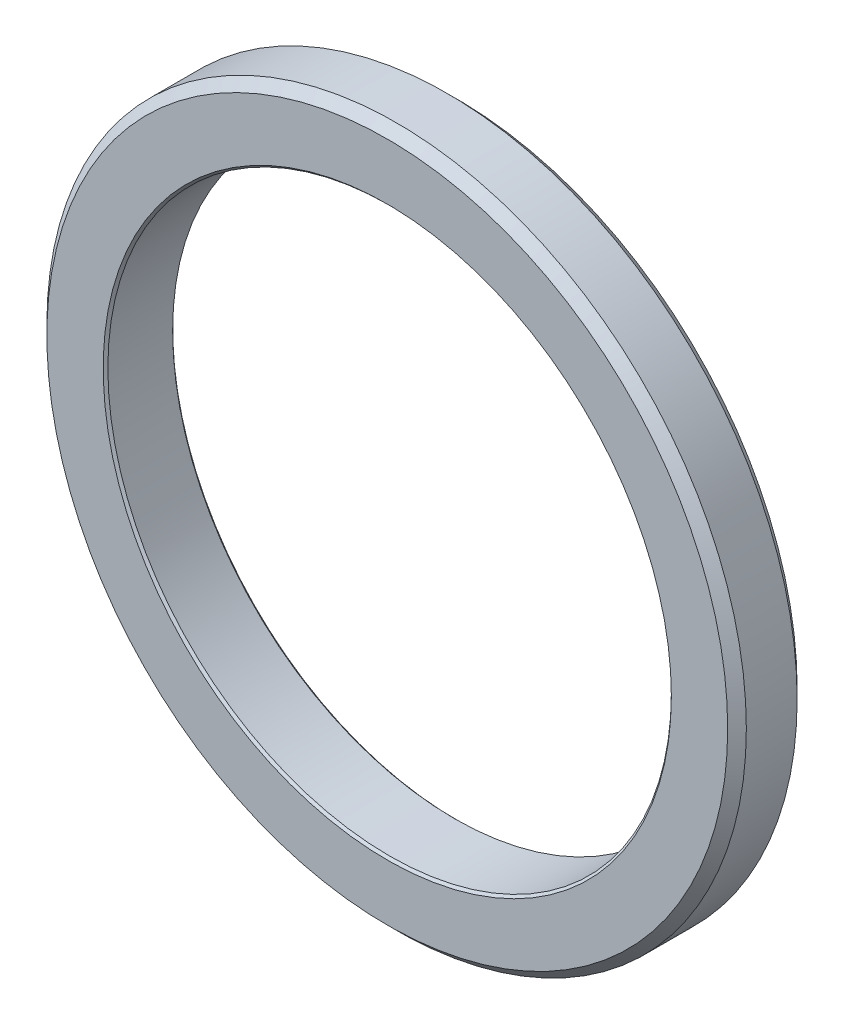
ISO-10303-21;
HEADER;
FILE_DESCRIPTION(('STEP AP214'),'2;1');
FILE_NAME('part.step','',(''),(''),'','','');
FILE_SCHEMA(('AUTOMOTIVE_DESIGN { 1 0 10303 214 1 1 1 1 }'));
ENDSEC;
DATA;
#1=APPLICATION_CONTEXT('core data for automotive mechanical design processes');
#2=APPLICATION_PROTOCOL_DEFINITION('international standard','automotive_design',2000,#1);
#3=PRODUCT_CONTEXT('',#1,'mechanical');
#4=PRODUCT('Part','Part','',(#3));
#5=PRODUCT_RELATED_PRODUCT_CATEGORY('part','',(#4));
#6=PRODUCT_DEFINITION_FORMATION('','',#4);
#7=PRODUCT_DEFINITION_CONTEXT('part definition',#1,'design');
#8=PRODUCT_DEFINITION('design','',#6,#7);
#9=PRODUCT_DEFINITION_SHAPE('','',#8);
#10=(LENGTH_UNIT() NAMED_UNIT(*) SI_UNIT(.MILLI.,.METRE.));
#11=(NAMED_UNIT(*) PLANE_ANGLE_UNIT() SI_UNIT($,.RADIAN.));
#12=(NAMED_UNIT(*) SI_UNIT($,.STERADIAN.) SOLID_ANGLE_UNIT());
#13=UNCERTAINTY_MEASURE_WITH_UNIT(LENGTH_MEASURE(1.E-05),#10,'distance_accuracy_value','');
#14=(GEOMETRIC_REPRESENTATION_CONTEXT(3) GLOBAL_UNCERTAINTY_ASSIGNED_CONTEXT((#13)) GLOBAL_UNIT_ASSIGNED_CONTEXT((#10,
#11,#12)) REPRESENTATION_CONTEXT('',''));
#15=CARTESIAN_POINT('',(0.,0.,0.));
#16=DIRECTION('',(0.,0.,1.));
#17=DIRECTION('',(1.,0.,0.));
#18=AXIS2_PLACEMENT_3D('',#15,#16,#17);
#19=CARTESIAN_POINT('',(0.,36.5195,0.));
#20=DIRECTION('',(0.,0.,-1.));
#21=DIRECTION('',(-1.,0.,0.));
#22=AXIS2_PLACEMENT_3D('',#19,#20,#21);
#23=PLANE('',#22);
#24=CARTESIAN_POINT('',(0.,0.,0.));
#25=DIRECTION('',(0.,0.,1.));
#26=DIRECTION('',(1.,0.,0.));
#27=AXIS2_PLACEMENT_3D('',#24,#25,#26);
#28=CIRCLE('',#27,30.475);
#29=CARTESIAN_POINT('',(30.475,0.,0.));
#30=VERTEX_POINT('',#29);
#31=EDGE_CURVE('E10',#30,#30,#28,.T.);
#32=ORIENTED_EDGE('',*,*,#31,.F.);
#33=EDGE_LOOP('',(#32));
#34=FACE_BOUND('',#33,.T.);
#35=CARTESIAN_POINT('',(0.,0.,0.));
#36=DIRECTION('',(0.,0.,1.));
#37=DIRECTION('',(1.,0.,0.));
#38=AXIS2_PLACEMENT_3D('',#35,#36,#37);
#39=CIRCLE('',#38,36.5195);
#40=CARTESIAN_POINT('',(36.5195,0.,0.));
#41=VERTEX_POINT('',#40);
#42=EDGE_CURVE('E67',#41,#41,#39,.T.);
#43=ORIENTED_EDGE('',*,*,#42,.T.);
#44=EDGE_LOOP('',(#43));
#45=FACE_BOUND('',#44,.T.);
#46=ADVANCED_FACE('F39',(#34,#45),#23,.F.);
#47=CARTESIAN_POINT('',(0.,0.,0.));
#48=DIRECTION('',(0.,0.,1.));
#49=DIRECTION('',(1.,0.,0.));
#50=AXIS2_PLACEMENT_3D('',#47,#48,#49);
#51=CONICAL_SURFACE('',#50,30.475,0.785398163397449);
#52=CARTESIAN_POINT('',(0.,0.,-0.250000000000001));
#53=DIRECTION('',(0.,0.,1.));
#54=DIRECTION('',(1.,0.,0.));
#55=AXIS2_PLACEMENT_3D('',#52,#53,#54);
#56=CIRCLE('',#55,30.225);
#57=CARTESIAN_POINT('',(30.225,0.,-0.250000000000001));
#58=VERTEX_POINT('',#57);
#59=EDGE_CURVE('E45',#58,#58,#56,.T.);
#60=ORIENTED_EDGE('',*,*,#59,.F.);
#61=EDGE_LOOP('',(#60));
#62=FACE_BOUND('',#61,.T.);
#63=ORIENTED_EDGE('',*,*,#31,.T.);
#64=EDGE_LOOP('',(#63));
#65=FACE_BOUND('',#64,.T.);
#66=ADVANCED_FACE('F104',(#62,#65),#51,.F.);
#67=CARTESIAN_POINT('',(0.,0.,0.));
#68=DIRECTION('',(0.,0.,1.));
#69=DIRECTION('',(1.,0.,0.));
#70=AXIS2_PLACEMENT_3D('',#67,#68,#69);
#71=CYLINDRICAL_SURFACE('',#70,30.225);
#72=CARTESIAN_POINT('',(0.,0.,-7.2));
#73=DIRECTION('',(0.,0.,1.));
#74=DIRECTION('',(1.,0.,0.));
#75=AXIS2_PLACEMENT_3D('',#72,#73,#74);
#76=CIRCLE('',#75,30.225);
#77=CARTESIAN_POINT('',(30.225,0.,-7.2));
#78=VERTEX_POINT('',#77);
#79=EDGE_CURVE('E49',#78,#78,#76,.T.);
#80=ORIENTED_EDGE('',*,*,#79,.F.);
#81=EDGE_LOOP('',(#80));
#82=FACE_BOUND('',#81,.T.);
#83=ORIENTED_EDGE('',*,*,#59,.T.);
#84=EDGE_LOOP('',(#83));
#85=FACE_BOUND('',#84,.T.);
#86=ADVANCED_FACE('F99',(#82,#85),#71,.F.);
#87=CARTESIAN_POINT('',(0.,0.,-7.2));
#88=DIRECTION('',(0.,0.,-1.));
#89=DIRECTION('',(-1.,0.,0.));
#90=AXIS2_PLACEMENT_3D('',#87,#88,#89);
#91=CONICAL_SURFACE('',#90,30.225,0.785398163397448);
#92=CARTESIAN_POINT('',(0.,0.,-7.45));
#93=DIRECTION('',(0.,0.,1.));
#94=DIRECTION('',(1.,0.,0.));
#95=AXIS2_PLACEMENT_3D('',#92,#93,#94);
#96=CIRCLE('',#95,30.475);
#97=CARTESIAN_POINT('',(30.475,0.,-7.45));
#98=VERTEX_POINT('',#97);
#99=EDGE_CURVE('E53',#98,#98,#96,.T.);
#100=ORIENTED_EDGE('',*,*,#99,.F.);
#101=EDGE_LOOP('',(#100));
#102=FACE_BOUND('',#101,.T.);
#103=ORIENTED_EDGE('',*,*,#79,.T.);
#104=EDGE_LOOP('',(#103));
#105=FACE_BOUND('',#104,.T.);
#106=ADVANCED_FACE('F93',(#102,#105),#91,.F.);
#107=CARTESIAN_POINT('',(0.,36.5195,-7.45));
#108=DIRECTION('',(0.,0.,1.));
#109=DIRECTION('',(1.,0.,0.));
#110=AXIS2_PLACEMENT_3D('',#107,#108,#109);
#111=PLANE('',#110);
#112=CARTESIAN_POINT('',(0.,0.,-7.45));
#113=DIRECTION('',(0.,0.,1.));
#114=DIRECTION('',(1.,0.,0.));
#115=AXIS2_PLACEMENT_3D('',#112,#113,#114);
#116=CIRCLE('',#115,36.5195);
#117=CARTESIAN_POINT('',(36.5195,0.,-7.45));
#118=VERTEX_POINT('',#117);
#119=EDGE_CURVE('E58',#118,#118,#116,.T.);
#120=ORIENTED_EDGE('',*,*,#119,.F.);
#121=EDGE_LOOP('',(#120));
#122=FACE_BOUND('',#121,.T.);
#123=ORIENTED_EDGE('',*,*,#99,.T.);
#124=EDGE_LOOP('',(#123));
#125=FACE_BOUND('',#124,.T.);
#126=ADVANCED_FACE('F87',(#122,#125),#111,.F.);
#127=CARTESIAN_POINT('',(0.,0.,-7.45));
#128=DIRECTION('',(0.,0.,1.));
#129=DIRECTION('',(1.,0.,0.));
#130=AXIS2_PLACEMENT_3D('',#127,#128,#129);
#131=CONICAL_SURFACE('',#130,36.5195,0.785398163397448);
#132=CARTESIAN_POINT('',(0.,0.,-6.45));
#133=DIRECTION('',(0.,0.,1.));
#134=DIRECTION('',(1.,0.,0.));
#135=AXIS2_PLACEMENT_3D('',#132,#133,#134);
#136=CIRCLE('',#135,37.5195);
#137=CARTESIAN_POINT('',(37.5195,0.,-6.45));
#138=VERTEX_POINT('',#137);
#139=EDGE_CURVE('E61',#138,#138,#136,.T.);
#140=ORIENTED_EDGE('',*,*,#139,.F.);
#141=EDGE_LOOP('',(#140));
#142=FACE_BOUND('',#141,.T.);
#143=ORIENTED_EDGE('',*,*,#119,.T.);
#144=EDGE_LOOP('',(#143));
#145=FACE_BOUND('',#144,.T.);
#146=ADVANCED_FACE('F81',(#142,#145),#131,.T.);
#147=CARTESIAN_POINT('',(0.,0.,0.));
#148=DIRECTION('',(0.,0.,1.));
#149=DIRECTION('',(1.,0.,0.));
#150=AXIS2_PLACEMENT_3D('',#147,#148,#149);
#151=CYLINDRICAL_SURFACE('',#150,37.5195);
#152=CARTESIAN_POINT('',(0.,0.,-1.));
#153=DIRECTION('',(0.,0.,1.));
#154=DIRECTION('',(1.,0.,0.));
#155=AXIS2_PLACEMENT_3D('',#152,#153,#154);
#156=CIRCLE('',#155,37.5195);
#157=CARTESIAN_POINT('',(37.5195,0.,-1.));
#158=VERTEX_POINT('',#157);
#159=EDGE_CURVE('E64',#158,#158,#156,.T.);
#160=ORIENTED_EDGE('',*,*,#159,.F.);
#161=EDGE_LOOP('',(#160));
#162=FACE_BOUND('',#161,.T.);
#163=ORIENTED_EDGE('',*,*,#139,.T.);
#164=EDGE_LOOP('',(#163));
#165=FACE_BOUND('',#164,.T.);
#166=ADVANCED_FACE('F75',(#162,#165),#151,.T.);
#167=CARTESIAN_POINT('',(0.,0.,-1.));
#168=DIRECTION('',(0.,0.,-1.));
#169=DIRECTION('',(-1.,0.,0.));
#170=AXIS2_PLACEMENT_3D('',#167,#168,#169);
#171=CONICAL_SURFACE('',#170,37.5195,0.785398163397449);
#172=ORIENTED_EDGE('',*,*,#42,.F.);
#173=EDGE_LOOP('',(#172));
#174=FACE_BOUND('',#173,.T.);
#175=ORIENTED_EDGE('',*,*,#159,.T.);
#176=EDGE_LOOP('',(#175));
#177=FACE_BOUND('',#176,.T.);
#178=ADVANCED_FACE('F72',(#174,#177),#171,.T.);
#179=CLOSED_SHELL('',(#46,#66,#86,#106,#126,#146,#166,#178));
#180=MANIFOLD_SOLID_BREP('B2',#179);
#181=ADVANCED_BREP_SHAPE_REPRESENTATION('',(#18,#180),#14);
#182=SHAPE_DEFINITION_REPRESENTATION(#9,#181);
ENDSEC;
END-ISO-10303-21;
